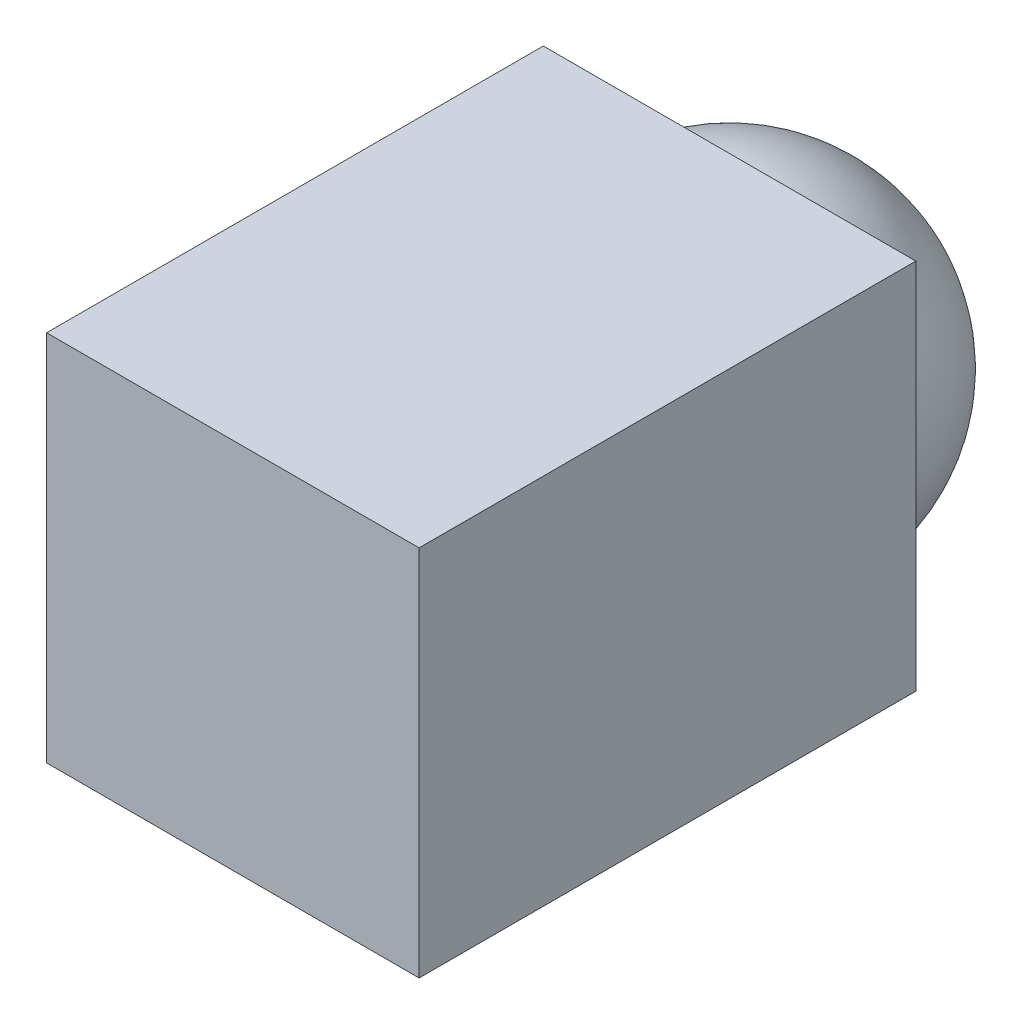
ISO-10303-21;
HEADER;
FILE_DESCRIPTION(('STEP AP214'),'2;1');
FILE_NAME('part.step','',(''),(''),'','','');
FILE_SCHEMA(('AUTOMOTIVE_DESIGN { 1 0 10303 214 1 1 1 1 }'));
ENDSEC;
DATA;
#1=APPLICATION_CONTEXT('core data for automotive mechanical design processes');
#2=APPLICATION_PROTOCOL_DEFINITION('international standard','automotive_design',2000,#1);
#3=PRODUCT_CONTEXT('',#1,'mechanical');
#4=PRODUCT('Part','Part','',(#3));
#5=PRODUCT_RELATED_PRODUCT_CATEGORY('part','',(#4));
#6=PRODUCT_DEFINITION_FORMATION('','',#4);
#7=PRODUCT_DEFINITION_CONTEXT('part definition',#1,'design');
#8=PRODUCT_DEFINITION('design','',#6,#7);
#9=PRODUCT_DEFINITION_SHAPE('','',#8);
#10=(LENGTH_UNIT() NAMED_UNIT(*) SI_UNIT(.MILLI.,.METRE.));
#11=(NAMED_UNIT(*) PLANE_ANGLE_UNIT() SI_UNIT($,.RADIAN.));
#12=(NAMED_UNIT(*) SI_UNIT($,.STERADIAN.) SOLID_ANGLE_UNIT());
#13=UNCERTAINTY_MEASURE_WITH_UNIT(LENGTH_MEASURE(1.E-05),#10,'distance_accuracy_value','');
#14=(GEOMETRIC_REPRESENTATION_CONTEXT(3) GLOBAL_UNCERTAINTY_ASSIGNED_CONTEXT((#13)) GLOBAL_UNIT_ASSIGNED_CONTEXT((#10,
#11,#12)) REPRESENTATION_CONTEXT('',''));
#15=CARTESIAN_POINT('',(0.,0.,0.));
#16=DIRECTION('',(0.,0.,1.));
#17=DIRECTION('',(1.,0.,0.));
#18=AXIS2_PLACEMENT_3D('',#15,#16,#17);
#19=CARTESIAN_POINT('',(0.,0.,20.));
#20=DIRECTION('',(1.,0.,0.));
#21=DIRECTION('',(0.,1.,0.));
#22=AXIS2_PLACEMENT_3D('',#19,#20,#21);
#23=PLANE('',#22);
#24=DIRECTION('',(0.,-1.,0.));
#25=VECTOR('',#24,1.);
#26=CARTESIAN_POINT('',(0.,0.,0.));
#27=LINE('',#26,#25);
#28=CARTESIAN_POINT('',(0.,0.,0.));
#29=VERTEX_POINT('',#28);
#30=CARTESIAN_POINT('',(0.,-15.,0.));
#31=VERTEX_POINT('',#30);
#32=EDGE_CURVE('E116',#29,#31,#27,.T.);
#33=ORIENTED_EDGE('',*,*,#32,.T.);
#34=DIRECTION('',(0.,0.,-1.));
#35=VECTOR('',#34,1.);
#36=CARTESIAN_POINT('',(0.,-15.,20.));
#37=LINE('',#36,#35);
#38=CARTESIAN_POINT('',(0.,-15.,20.));
#39=VERTEX_POINT('',#38);
#40=EDGE_CURVE('E54',#39,#31,#37,.T.);
#41=ORIENTED_EDGE('',*,*,#40,.F.);
#42=DIRECTION('',(0.,-1.,0.));
#43=VECTOR('',#42,1.);
#44=CARTESIAN_POINT('',(0.,0.,20.));
#45=LINE('',#44,#43);
#46=CARTESIAN_POINT('',(0.,0.,20.));
#47=VERTEX_POINT('',#46);
#48=EDGE_CURVE('E98',#47,#39,#45,.T.);
#49=ORIENTED_EDGE('',*,*,#48,.F.);
#50=DIRECTION('',(0.,0.,-1.));
#51=VECTOR('',#50,1.);
#52=CARTESIAN_POINT('',(0.,0.,20.));
#53=LINE('',#52,#51);
#54=EDGE_CURVE('E112',#47,#29,#53,.T.);
#55=ORIENTED_EDGE('',*,*,#54,.T.);
#56=EDGE_LOOP('',(#33,#41,#49,#55));
#57=FACE_BOUND('',#56,.T.);
#58=ADVANCED_FACE('F45',(#57),#23,.F.);
#59=CARTESIAN_POINT('',(0.,-15.,20.));
#60=DIRECTION('',(0.,1.,0.));
#61=DIRECTION('',(0.,0.,1.));
#62=AXIS2_PLACEMENT_3D('',#59,#60,#61);
#63=PLANE('',#62);
#64=DIRECTION('',(1.,0.,0.));
#65=VECTOR('',#64,1.);
#66=CARTESIAN_POINT('',(0.,-15.,0.));
#67=LINE('',#66,#65);
#68=CARTESIAN_POINT('',(15.,-15.,0.));
#69=VERTEX_POINT('',#68);
#70=EDGE_CURVE('E104',#31,#69,#67,.T.);
#71=ORIENTED_EDGE('',*,*,#70,.T.);
#72=DIRECTION('',(0.,0.,-1.));
#73=VECTOR('',#72,1.);
#74=CARTESIAN_POINT('',(15.,-15.,20.));
#75=LINE('',#74,#73);
#76=CARTESIAN_POINT('',(15.,-15.,20.));
#77=VERTEX_POINT('',#76);
#78=EDGE_CURVE('E102',#77,#69,#75,.T.);
#79=ORIENTED_EDGE('',*,*,#78,.F.);
#80=DIRECTION('',(1.,0.,0.));
#81=VECTOR('',#80,1.);
#82=CARTESIAN_POINT('',(0.,-15.,20.));
#83=LINE('',#82,#81);
#84=EDGE_CURVE('E93',#39,#77,#83,.T.);
#85=ORIENTED_EDGE('',*,*,#84,.F.);
#86=ORIENTED_EDGE('',*,*,#40,.T.);
#87=EDGE_LOOP('',(#71,#79,#85,#86));
#88=FACE_BOUND('',#87,.T.);
#89=ADVANCED_FACE('F103',(#88),#63,.F.);
#90=CARTESIAN_POINT('',(15.,0.,20.));
#91=DIRECTION('',(-1.,0.,0.));
#92=DIRECTION('',(0.,0.,1.));
#93=AXIS2_PLACEMENT_3D('',#90,#91,#92);
#94=PLANE('',#93);
#95=DIRECTION('',(0.,1.,0.));
#96=VECTOR('',#95,1.);
#97=CARTESIAN_POINT('',(15.,0.,0.));
#98=LINE('',#97,#96);
#99=CARTESIAN_POINT('',(15.,0.,0.));
#100=VERTEX_POINT('',#99);
#101=EDGE_CURVE('E79',#69,#100,#98,.T.);
#102=ORIENTED_EDGE('',*,*,#101,.T.);
#103=DIRECTION('',(0.,0.,-1.));
#104=VECTOR('',#103,1.);
#105=CARTESIAN_POINT('',(15.,0.,20.));
#106=LINE('',#105,#104);
#107=CARTESIAN_POINT('',(15.,0.,20.));
#108=VERTEX_POINT('',#107);
#109=EDGE_CURVE('E106',#108,#100,#106,.T.);
#110=ORIENTED_EDGE('',*,*,#109,.F.);
#111=DIRECTION('',(0.,1.,0.));
#112=VECTOR('',#111,1.);
#113=CARTESIAN_POINT('',(15.,0.,20.));
#114=LINE('',#113,#112);
#115=EDGE_CURVE('E96',#77,#108,#114,.T.);
#116=ORIENTED_EDGE('',*,*,#115,.F.);
#117=ORIENTED_EDGE('',*,*,#78,.T.);
#118=EDGE_LOOP('',(#102,#110,#116,#117));
#119=FACE_BOUND('',#118,.T.);
#120=ADVANCED_FACE('F108',(#119),#94,.F.);
#121=CARTESIAN_POINT('',(0.,0.,20.));
#122=DIRECTION('',(0.,-1.,0.));
#123=DIRECTION('',(0.,0.,-1.));
#124=AXIS2_PLACEMENT_3D('',#121,#122,#123);
#125=PLANE('',#124);
#126=DIRECTION('',(-1.,0.,0.));
#127=VECTOR('',#126,1.);
#128=CARTESIAN_POINT('',(0.,0.,0.));
#129=LINE('',#128,#127);
#130=EDGE_CURVE('E85',#100,#29,#129,.T.);
#131=ORIENTED_EDGE('',*,*,#130,.T.);
#132=ORIENTED_EDGE('',*,*,#54,.F.);
#133=DIRECTION('',(-1.,0.,0.));
#134=VECTOR('',#133,1.);
#135=CARTESIAN_POINT('',(0.,0.,20.));
#136=LINE('',#135,#134);
#137=EDGE_CURVE('E62',#108,#47,#136,.T.);
#138=ORIENTED_EDGE('',*,*,#137,.F.);
#139=ORIENTED_EDGE('',*,*,#109,.T.);
#140=EDGE_LOOP('',(#131,#132,#138,#139));
#141=FACE_BOUND('',#140,.T.);
#142=ADVANCED_FACE('F144',(#141),#125,.F.);
#143=CARTESIAN_POINT('',(0.,0.,20.));
#144=DIRECTION('',(0.,0.,1.));
#145=DIRECTION('',(1.,0.,0.));
#146=AXIS2_PLACEMENT_3D('',#143,#144,#145);
#147=PLANE('',#146);
#148=ORIENTED_EDGE('',*,*,#48,.T.);
#149=ORIENTED_EDGE('',*,*,#84,.T.);
#150=ORIENTED_EDGE('',*,*,#115,.T.);
#151=ORIENTED_EDGE('',*,*,#137,.T.);
#152=EDGE_LOOP('',(#148,#149,#150,#151));
#153=FACE_BOUND('',#152,.T.);
#154=ADVANCED_FACE('F94',(#153),#147,.T.);
#155=CARTESIAN_POINT('',(0.,0.,0.));
#156=DIRECTION('',(0.,0.,1.));
#157=DIRECTION('',(1.,0.,0.));
#158=AXIS2_PLACEMENT_3D('',#155,#156,#157);
#159=PLANE('',#158);
#160=CARTESIAN_POINT('',(7.5,-7.5,0.));
#161=DIRECTION('',(0.,0.,1.));
#162=DIRECTION('',(1.,0.,0.));
#163=AXIS2_PLACEMENT_3D('',#160,#161,#162);
#164=CIRCLE('',#163,7.);
#165=CARTESIAN_POINT('',(14.5,-7.5,0.));
#166=VERTEX_POINT('',#165);
#167=EDGE_CURVE('E11',#166,#166,#164,.F.);
#168=ORIENTED_EDGE('',*,*,#167,.F.);
#169=EDGE_LOOP('',(#168));
#170=FACE_BOUND('',#169,.T.);
#171=ORIENTED_EDGE('',*,*,#32,.F.);
#172=ORIENTED_EDGE('',*,*,#130,.F.);
#173=ORIENTED_EDGE('',*,*,#101,.F.);
#174=ORIENTED_EDGE('',*,*,#70,.F.);
#175=EDGE_LOOP('',(#171,#172,#173,#174));
#176=FACE_BOUND('',#175,.T.);
#177=ADVANCED_FACE('F133',(#170,#176),#159,.F.);
#178=CARTESIAN_POINT('',(7.5,-7.5,0.));
#179=DIRECTION('',(-1.,0.,0.));
#180=DIRECTION('',(0.,1.,0.));
#181=AXIS2_PLACEMENT_3D('',#178,#179,#180);
#182=SPHERICAL_SURFACE('',#181,7.);
#183=CARTESIAN_POINT('',(7.5,-7.5,0.));
#184=DIRECTION('',(0.,0.,1.));
#185=DIRECTION('',(1.,0.,0.));
#186=AXIS2_PLACEMENT_3D('',#183,#184,#185);
#187=SPHERICAL_SURFACE('',#186,7.);
#188=ORIENTED_EDGE('',*,*,#167,.T.);
#189=EDGE_LOOP('',(#188));
#190=FACE_BOUND('',#189,.T.);
#191=ADVANCED_FACE('F135',(#190),#187,.T.);
#192=CLOSED_SHELL('',(#58,#89,#120,#142,#154,#177,#191));
#193=MANIFOLD_SOLID_BREP('B2',#192);
#194=ADVANCED_BREP_SHAPE_REPRESENTATION('',(#18,#193),#14);
#195=SHAPE_DEFINITION_REPRESENTATION(#9,#194);
ENDSEC;
END-ISO-10303-21;
